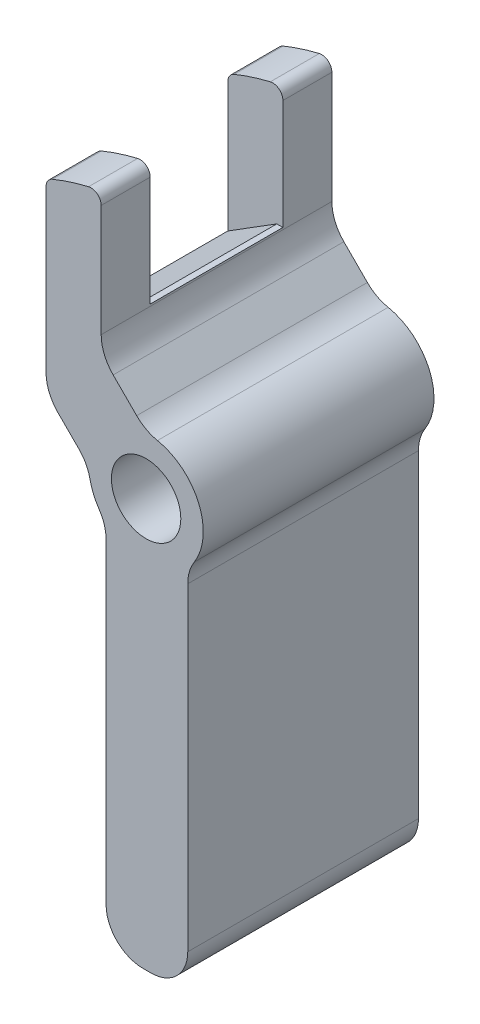
ISO-10303-21;
HEADER;
FILE_DESCRIPTION(('STEP AP214'),'2;1');
FILE_NAME('part.step','',(''),(''),'','','');
FILE_SCHEMA(('AUTOMOTIVE_DESIGN { 1 0 10303 214 1 1 1 1 }'));
ENDSEC;
DATA;
#1=APPLICATION_CONTEXT('core data for automotive mechanical design processes');
#2=APPLICATION_PROTOCOL_DEFINITION('international standard','automotive_design',2000,#1);
#3=PRODUCT_CONTEXT('',#1,'mechanical');
#4=PRODUCT('Part','Part','',(#3));
#5=PRODUCT_RELATED_PRODUCT_CATEGORY('part','',(#4));
#6=PRODUCT_DEFINITION_FORMATION('','',#4);
#7=PRODUCT_DEFINITION_CONTEXT('part definition',#1,'design');
#8=PRODUCT_DEFINITION('design','',#6,#7);
#9=PRODUCT_DEFINITION_SHAPE('','',#8);
#10=(LENGTH_UNIT() NAMED_UNIT(*) SI_UNIT(.MILLI.,.METRE.));
#11=(NAMED_UNIT(*) PLANE_ANGLE_UNIT() SI_UNIT($,.RADIAN.));
#12=(NAMED_UNIT(*) SI_UNIT($,.STERADIAN.) SOLID_ANGLE_UNIT());
#13=UNCERTAINTY_MEASURE_WITH_UNIT(LENGTH_MEASURE(1.E-05),#10,'distance_accuracy_value','');
#14=(GEOMETRIC_REPRESENTATION_CONTEXT(3) GLOBAL_UNCERTAINTY_ASSIGNED_CONTEXT((#13)) GLOBAL_UNIT_ASSIGNED_CONTEXT((#10,
#11,#12)) REPRESENTATION_CONTEXT('',''));
#15=CARTESIAN_POINT('',(0.,0.,0.));
#16=DIRECTION('',(0.,0.,1.));
#17=DIRECTION('',(1.,0.,0.));
#18=AXIS2_PLACEMENT_3D('',#15,#16,#17);
#19=CARTESIAN_POINT('',(4.6996956240946,11.9079283311665,11.3));
#20=DIRECTION('',(0.,0.,-1.));
#21=DIRECTION('',(-1.,0.,0.));
#22=AXIS2_PLACEMENT_3D('',#19,#20,#21);
#23=CYLINDRICAL_SURFACE('',#22,12.1557739077731);
#24=CARTESIAN_POINT('',(4.6996956240946,11.9079283311665,11.3));
#25=DIRECTION('',(0.,0.,1.));
#26=DIRECTION('',(1.,0.,0.));
#27=AXIS2_PLACEMENT_3D('',#24,#25,#26);
#28=CIRCLE('',#27,12.1557739077731);
#29=CARTESIAN_POINT('',(1.88387319903025,23.7330703331638,11.3));
#30=VERTEX_POINT('',#29);
#31=CARTESIAN_POINT('',(0.11094796843419,23.1643147073339,11.3));
#32=VERTEX_POINT('',#31);
#33=EDGE_CURVE('E255',#30,#32,#28,.T.);
#34=ORIENTED_EDGE('',*,*,#33,.F.);
#35=DIRECTION('',(0.,0.,-1.));
#36=VECTOR('',#35,1.);
#37=CARTESIAN_POINT('',(1.88387319903025,23.7330703331638,11.3));
#38=LINE('',#37,#36);
#39=CARTESIAN_POINT('',(1.88387319903025,23.7330703331638,8.9));
#40=VERTEX_POINT('',#39);
#41=EDGE_CURVE('E403',#30,#40,#38,.T.);
#42=ORIENTED_EDGE('',*,*,#41,.T.);
#43=CARTESIAN_POINT('',(4.6996956240946,11.9079283311665,8.9));
#44=DIRECTION('',(0.,0.,1.));
#45=DIRECTION('',(0.,-1.,0.));
#46=AXIS2_PLACEMENT_3D('',#43,#44,#45);
#47=CIRCLE('',#46,12.1557739077731);
#48=CARTESIAN_POINT('',(0.11094796843419,23.1643147073339,8.9));
#49=VERTEX_POINT('',#48);
#50=EDGE_CURVE('E447',#49,#40,#47,.F.);
#51=ORIENTED_EDGE('',*,*,#50,.F.);
#52=DIRECTION('',(0.,0.,-1.));
#53=VECTOR('',#52,1.);
#54=CARTESIAN_POINT('',(0.110947968434189,23.1643147073339,11.3));
#55=LINE('',#54,#53);
#56=EDGE_CURVE('E401',#49,#32,#55,.F.);
#57=ORIENTED_EDGE('',*,*,#56,.T.);
#58=EDGE_LOOP('',(#34,#42,#51,#57));
#59=FACE_BOUND('',#58,.T.);
#60=ADVANCED_FACE('F38',(#59),#23,.T.);
#61=CARTESIAN_POINT('',(4.6996956240946,11.9079283311665,11.3));
#62=DIRECTION('',(0.,0.,1.));
#63=DIRECTION('',(1.,0.,0.));
#64=AXIS2_PLACEMENT_3D('',#61,#62,#63);
#65=PLANE('',#64);
#66=DIRECTION('',(0.,1.,0.));
#67=VECTOR('',#66,1.);
#68=CARTESIAN_POINT('',(2.4996956240946,23.8629623878682,11.3));
#69=LINE('',#68,#67);
#70=CARTESIAN_POINT('',(2.4996956240946,17.7647825806589,11.3));
#71=VERTEX_POINT('',#70);
#72=CARTESIAN_POINT('',(2.4996956240946,23.2466701215559,11.3));
#73=VERTEX_POINT('',#72);
#74=EDGE_CURVE('E290',#71,#73,#69,.T.);
#75=ORIENTED_EDGE('',*,*,#74,.T.);
#76=CARTESIAN_POINT('',(1.9996956240946,23.2466701215559,11.3));
#77=DIRECTION('',(0.,0.,1.));
#78=DIRECTION('',(1.,0.,0.));
#79=AXIS2_PLACEMENT_3D('',#76,#77,#78);
#80=CIRCLE('',#79,0.5);
#81=EDGE_CURVE('E410',#73,#30,#80,.T.);
#82=ORIENTED_EDGE('',*,*,#81,.T.);
#83=ORIENTED_EDGE('',*,*,#33,.T.);
#84=CARTESIAN_POINT('',(0.299695624094605,22.7013089595481,11.3));
#85=DIRECTION('',(0.,0.,1.));
#86=DIRECTION('',(1.,0.,0.));
#87=AXIS2_PLACEMENT_3D('',#84,#85,#86);
#88=CIRCLE('',#87,0.5);
#89=CARTESIAN_POINT('',(-0.200304375905397,22.7013089595481,11.3));
#90=VERTEX_POINT('',#89);
#91=EDGE_CURVE('E53',#32,#90,#88,.T.);
#92=ORIENTED_EDGE('',*,*,#91,.T.);
#93=DIRECTION('',(0.,-1.,0.));
#94=VECTOR('',#93,1.);
#95=CARTESIAN_POINT('',(-0.200304375905404,14.8079283311666,11.3));
#96=LINE('',#95,#94);
#97=CARTESIAN_POINT('',(-0.200304375905399,14.8079283311666,11.3));
#98=VERTEX_POINT('',#97);
#99=EDGE_CURVE('E257',#90,#98,#96,.T.);
#100=ORIENTED_EDGE('',*,*,#99,.T.);
#101=CARTESIAN_POINT('',(1.7996956240946,14.8079283311665,11.3));
#102=DIRECTION('',(0.,0.,1.));
#103=DIRECTION('',(-1.,0.,0.));
#104=AXIS2_PLACEMENT_3D('',#101,#102,#103);
#105=CIRCLE('',#104,2.);
#106=CARTESIAN_POINT('',(0.385482061721495,13.3937147687935,11.3));
#107=VERTEX_POINT('',#106);
#108=EDGE_CURVE('E260',#98,#107,#105,.T.);
#109=ORIENTED_EDGE('',*,*,#108,.T.);
#110=DIRECTION('',(0.707106781186543,-0.707106781186552,0.));
#111=VECTOR('',#110,1.);
#112=CARTESIAN_POINT('',(1.40931575779213,12.3698810727228,11.3));
#113=LINE('',#112,#111);
#114=CARTESIAN_POINT('',(1.40931575779213,12.3698810727228,11.3));
#115=VERTEX_POINT('',#114);
#116=EDGE_CURVE('E262',#107,#115,#113,.T.);
#117=ORIENTED_EDGE('',*,*,#116,.T.);
#118=CARTESIAN_POINT('',(-0.0048978045809622,10.9556675103497,11.3));
#119=DIRECTION('',(0.,0.,-1.));
#120=DIRECTION('',(-1.,0.,0.));
#121=AXIS2_PLACEMENT_3D('',#118,#119,#120);
#122=CIRCLE('',#121,2.);
#123=CARTESIAN_POINT('',(1.95534945736718,11.3524428523567,11.3));
#124=VERTEX_POINT('',#123);
#125=EDGE_CURVE('E264',#115,#124,#122,.T.);
#126=ORIENTED_EDGE('',*,*,#125,.T.);
#127=CARTESIAN_POINT('',(4.6996956240946,11.9079283311665,11.3));
#128=DIRECTION('',(0.,0.,1.));
#129=DIRECTION('',(1.,0.,0.));
#130=AXIS2_PLACEMENT_3D('',#127,#128,#129);
#131=CIRCLE('',#130,2.8);
#132=CARTESIAN_POINT('',(2.3899337441291,10.3252091337539,11.3));
#133=VERTEX_POINT('',#132);
#134=EDGE_CURVE('E266',#124,#133,#131,.T.);
#135=ORIENTED_EDGE('',*,*,#134,.T.);
#136=CARTESIAN_POINT('',(0.740103829868062,9.19469542131638,11.3));
#137=DIRECTION('',(0.,0.,-1.));
#138=DIRECTION('',(-1.,0.,0.));
#139=AXIS2_PLACEMENT_3D('',#136,#137,#138);
#140=CIRCLE('',#139,1.99999999999999);
#141=CARTESIAN_POINT('',(2.74010382986804,9.19469542131641,11.3));
#142=VERTEX_POINT('',#141);
#143=EDGE_CURVE('E268',#133,#142,#140,.T.);
#144=ORIENTED_EDGE('',*,*,#143,.T.);
#145=DIRECTION('',(0.,-1.,0.));
#146=VECTOR('',#145,1.);
#147=CARTESIAN_POINT('',(2.74010382986804,9.19469542131641,11.3));
#148=LINE('',#147,#146);
#149=CARTESIAN_POINT('',(2.740103829868,-6.29207166883347,11.3));
#150=VERTEX_POINT('',#149);
#151=EDGE_CURVE('E270',#142,#150,#148,.T.);
#152=ORIENTED_EDGE('',*,*,#151,.T.);
#153=CARTESIAN_POINT('',(4.540103829868,-6.29207166883347,11.3));
#154=DIRECTION('',(0.,0.,1.));
#155=DIRECTION('',(-1.,0.,0.));
#156=AXIS2_PLACEMENT_3D('',#153,#154,#155);
#157=CIRCLE('',#156,1.8);
#158=CARTESIAN_POINT('',(4.540103829868,-8.09207166883347,11.3));
#159=VERTEX_POINT('',#158);
#160=EDGE_CURVE('E272',#150,#159,#157,.T.);
#161=ORIENTED_EDGE('',*,*,#160,.T.);
#162=DIRECTION('',(1.,0.,0.));
#163=VECTOR('',#162,1.);
#164=CARTESIAN_POINT('',(4.940103829868,-8.09207166883347,11.3));
#165=LINE('',#164,#163);
#166=CARTESIAN_POINT('',(4.940103829868,-8.09207166883347,11.3));
#167=VERTEX_POINT('',#166);
#168=EDGE_CURVE('E274',#159,#167,#165,.T.);
#169=ORIENTED_EDGE('',*,*,#168,.T.);
#170=CARTESIAN_POINT('',(4.940103829868,-6.29207166883347,11.3));
#171=DIRECTION('',(0.,0.,1.));
#172=DIRECTION('',(-1.,0.,0.));
#173=AXIS2_PLACEMENT_3D('',#170,#171,#172);
#174=CIRCLE('',#173,1.8);
#175=CARTESIAN_POINT('',(6.740103829868,-6.29207166883347,11.3));
#176=VERTEX_POINT('',#175);
#177=EDGE_CURVE('E276',#167,#176,#174,.T.);
#178=ORIENTED_EDGE('',*,*,#177,.T.);
#179=DIRECTION('',(0.,1.,0.));
#180=VECTOR('',#179,1.);
#181=CARTESIAN_POINT('',(6.740103829868,-6.29207166883347,11.3));
#182=LINE('',#181,#180);
#183=CARTESIAN_POINT('',(6.74010382986805,9.3165770368186,11.3));
#184=VERTEX_POINT('',#183);
#185=EDGE_CURVE('E278',#176,#184,#182,.T.);
#186=ORIENTED_EDGE('',*,*,#185,.T.);
#187=CARTESIAN_POINT('',(8.74010382986806,9.31657703681862,11.3));
#188=DIRECTION('',(0.,0.,-1.));
#189=DIRECTION('',(-1.,0.,0.));
#190=AXIS2_PLACEMENT_3D('',#187,#188,#189);
#191=CIRCLE('',#190,2.00000000000002);
#192=CARTESIAN_POINT('',(7.05660041079577,10.3963067427969,11.3));
#193=VERTEX_POINT('',#192);
#194=EDGE_CURVE('E280',#184,#193,#191,.T.);
#195=ORIENTED_EDGE('',*,*,#194,.T.);
#196=CARTESIAN_POINT('',(4.6996956240946,11.9079283311665,11.3));
#197=DIRECTION('',(0.,0.,1.));
#198=DIRECTION('',(1.,0.,0.));
#199=AXIS2_PLACEMENT_3D('',#196,#197,#198);
#200=CIRCLE('',#199,2.8);
#201=CARTESIAN_POINT('',(5.25518110290442,14.6522744978939,11.3));
#202=VERTEX_POINT('',#201);
#203=EDGE_CURVE('E282',#193,#202,#200,.T.);
#204=ORIENTED_EDGE('',*,*,#203,.T.);
#205=CARTESIAN_POINT('',(5.65195644491145,16.6125217598421,11.3));
#206=DIRECTION('',(0.,0.,-1.));
#207=DIRECTION('',(1.,0.,0.));
#208=AXIS2_PLACEMENT_3D('',#205,#206,#207);
#209=CIRCLE('',#208,2.);
#210=CARTESIAN_POINT('',(4.23774288253834,15.198308197469,11.3));
#211=VERTEX_POINT('',#210);
#212=EDGE_CURVE('E284',#202,#211,#209,.T.);
#213=ORIENTED_EDGE('',*,*,#212,.T.);
#214=DIRECTION('',(-0.707106781186544,0.707106781186551,0.));
#215=VECTOR('',#214,1.);
#216=CARTESIAN_POINT('',(4.23774288253834,15.198308197469,11.3));
#217=LINE('',#216,#215);
#218=CARTESIAN_POINT('',(3.0854820617215,16.3505690182858,11.3));
#219=VERTEX_POINT('',#218);
#220=EDGE_CURVE('E286',#211,#219,#217,.T.);
#221=ORIENTED_EDGE('',*,*,#220,.T.);
#222=CARTESIAN_POINT('',(4.49969562409461,17.7647825806589,11.3));
#223=DIRECTION('',(0.,0.,-1.));
#224=DIRECTION('',(1.,0.,0.));
#225=AXIS2_PLACEMENT_3D('',#222,#223,#224);
#226=CIRCLE('',#225,2.);
#227=EDGE_CURVE('E288',#219,#71,#226,.T.);
#228=ORIENTED_EDGE('',*,*,#227,.T.);
#229=EDGE_LOOP('',(#75,#82,#83,#92,#100,#109,#117,#126,#135,#144,#152,#161,#169,#178,#186,#195,
#204,#213,#221,#228));
#230=FACE_BOUND('',#229,.T.);
#231=CARTESIAN_POINT('',(4.6996956240946,11.9079283311665,11.3));
#232=DIRECTION('',(0.,0.,1.));
#233=DIRECTION('',(1.,0.,0.));
#234=AXIS2_PLACEMENT_3D('',#231,#232,#233);
#235=CIRCLE('',#234,1.7);
#236=CARTESIAN_POINT('',(6.3996956240946,11.9079283311665,11.3));
#237=VERTEX_POINT('',#236);
#238=EDGE_CURVE('E249',#237,#237,#235,.T.);
#239=ORIENTED_EDGE('',*,*,#238,.F.);
#240=EDGE_LOOP('',(#239));
#241=FACE_BOUND('',#240,.T.);
#242=ADVANCED_FACE('F437',(#230,#241),#65,.T.);
#243=CARTESIAN_POINT('',(4.6996956240946,11.9079283311665,0.));
#244=DIRECTION('',(0.,0.,1.));
#245=DIRECTION('',(1.,0.,0.));
#246=AXIS2_PLACEMENT_3D('',#243,#244,#245);
#247=PLANE('',#246);
#248=CARTESIAN_POINT('',(4.6996956240946,11.9079283311665,0.));
#249=DIRECTION('',(0.,0.,1.));
#250=DIRECTION('',(1.,0.,0.));
#251=AXIS2_PLACEMENT_3D('',#248,#249,#250);
#252=CIRCLE('',#251,12.1557739077731);
#253=CARTESIAN_POINT('',(1.88387319903025,23.7330703331638,0.));
#254=VERTEX_POINT('',#253);
#255=CARTESIAN_POINT('',(0.11094796843419,23.1643147073339,0.));
#256=VERTEX_POINT('',#255);
#257=EDGE_CURVE('E252',#254,#256,#252,.T.);
#258=ORIENTED_EDGE('',*,*,#257,.F.);
#259=CARTESIAN_POINT('',(1.9996956240946,23.2466701215559,0.));
#260=DIRECTION('',(0.,0.,1.));
#261=DIRECTION('',(1.,0.,0.));
#262=AXIS2_PLACEMENT_3D('',#259,#260,#261);
#263=CIRCLE('',#262,0.5);
#264=CARTESIAN_POINT('',(2.4996956240946,23.2466701215559,0.));
#265=VERTEX_POINT('',#264);
#266=EDGE_CURVE('E392',#254,#265,#263,.F.);
#267=ORIENTED_EDGE('',*,*,#266,.T.);
#268=DIRECTION('',(0.,1.,0.));
#269=VECTOR('',#268,1.);
#270=CARTESIAN_POINT('',(2.4996956240946,23.8629623878682,0.));
#271=LINE('',#270,#269);
#272=CARTESIAN_POINT('',(2.4996956240946,17.7647825806589,0.));
#273=VERTEX_POINT('',#272);
#274=EDGE_CURVE('E258',#273,#265,#271,.T.);
#275=ORIENTED_EDGE('',*,*,#274,.F.);
#276=CARTESIAN_POINT('',(4.49969562409461,17.7647825806589,0.));
#277=DIRECTION('',(0.,0.,-1.));
#278=DIRECTION('',(1.,0.,0.));
#279=AXIS2_PLACEMENT_3D('',#276,#277,#278);
#280=CIRCLE('',#279,2.);
#281=CARTESIAN_POINT('',(3.0854820617215,16.3505690182858,0.));
#282=VERTEX_POINT('',#281);
#283=EDGE_CURVE('E326',#282,#273,#280,.T.);
#284=ORIENTED_EDGE('',*,*,#283,.F.);
#285=DIRECTION('',(-0.707106781186544,0.707106781186551,0.));
#286=VECTOR('',#285,1.);
#287=CARTESIAN_POINT('',(4.23774288253834,15.198308197469,0.));
#288=LINE('',#287,#286);
#289=CARTESIAN_POINT('',(4.23774288253834,15.198308197469,0.));
#290=VERTEX_POINT('',#289);
#291=EDGE_CURVE('E324',#290,#282,#288,.T.);
#292=ORIENTED_EDGE('',*,*,#291,.F.);
#293=CARTESIAN_POINT('',(5.65195644491145,16.6125217598421,0.));
#294=DIRECTION('',(0.,0.,-1.));
#295=DIRECTION('',(1.,0.,0.));
#296=AXIS2_PLACEMENT_3D('',#293,#294,#295);
#297=CIRCLE('',#296,2.);
#298=CARTESIAN_POINT('',(5.25518110290442,14.6522744978939,0.));
#299=VERTEX_POINT('',#298);
#300=EDGE_CURVE('E322',#299,#290,#297,.T.);
#301=ORIENTED_EDGE('',*,*,#300,.F.);
#302=CARTESIAN_POINT('',(4.6996956240946,11.9079283311665,0.));
#303=DIRECTION('',(0.,0.,1.));
#304=DIRECTION('',(1.,0.,0.));
#305=AXIS2_PLACEMENT_3D('',#302,#303,#304);
#306=CIRCLE('',#305,2.8);
#307=CARTESIAN_POINT('',(7.05660041079577,10.3963067427969,0.));
#308=VERTEX_POINT('',#307);
#309=EDGE_CURVE('E320',#308,#299,#306,.T.);
#310=ORIENTED_EDGE('',*,*,#309,.F.);
#311=CARTESIAN_POINT('',(8.74010382986806,9.31657703681862,0.));
#312=DIRECTION('',(0.,0.,-1.));
#313=DIRECTION('',(-1.,0.,0.));
#314=AXIS2_PLACEMENT_3D('',#311,#312,#313);
#315=CIRCLE('',#314,2.00000000000002);
#316=CARTESIAN_POINT('',(6.74010382986805,9.3165770368186,0.));
#317=VERTEX_POINT('',#316);
#318=EDGE_CURVE('E318',#317,#308,#315,.T.);
#319=ORIENTED_EDGE('',*,*,#318,.F.);
#320=DIRECTION('',(0.,1.,0.));
#321=VECTOR('',#320,1.);
#322=CARTESIAN_POINT('',(6.740103829868,-6.29207166883347,0.));
#323=LINE('',#322,#321);
#324=CARTESIAN_POINT('',(6.740103829868,-6.29207166883347,0.));
#325=VERTEX_POINT('',#324);
#326=EDGE_CURVE('E316',#325,#317,#323,.T.);
#327=ORIENTED_EDGE('',*,*,#326,.F.);
#328=CARTESIAN_POINT('',(4.940103829868,-6.29207166883347,0.));
#329=DIRECTION('',(0.,0.,1.));
#330=DIRECTION('',(-1.,0.,0.));
#331=AXIS2_PLACEMENT_3D('',#328,#329,#330);
#332=CIRCLE('',#331,1.8);
#333=CARTESIAN_POINT('',(4.940103829868,-8.09207166883347,0.));
#334=VERTEX_POINT('',#333);
#335=EDGE_CURVE('E314',#334,#325,#332,.T.);
#336=ORIENTED_EDGE('',*,*,#335,.F.);
#337=DIRECTION('',(1.,0.,0.));
#338=VECTOR('',#337,1.);
#339=CARTESIAN_POINT('',(4.940103829868,-8.09207166883347,0.));
#340=LINE('',#339,#338);
#341=CARTESIAN_POINT('',(4.540103829868,-8.09207166883347,0.));
#342=VERTEX_POINT('',#341);
#343=EDGE_CURVE('E312',#342,#334,#340,.T.);
#344=ORIENTED_EDGE('',*,*,#343,.F.);
#345=CARTESIAN_POINT('',(4.540103829868,-6.29207166883347,0.));
#346=DIRECTION('',(0.,0.,1.));
#347=DIRECTION('',(-1.,0.,0.));
#348=AXIS2_PLACEMENT_3D('',#345,#346,#347);
#349=CIRCLE('',#348,1.8);
#350=CARTESIAN_POINT('',(2.740103829868,-6.29207166883347,0.));
#351=VERTEX_POINT('',#350);
#352=EDGE_CURVE('E310',#351,#342,#349,.T.);
#353=ORIENTED_EDGE('',*,*,#352,.F.);
#354=DIRECTION('',(0.,-1.,0.));
#355=VECTOR('',#354,1.);
#356=CARTESIAN_POINT('',(2.74010382986804,9.19469542131641,0.));
#357=LINE('',#356,#355);
#358=CARTESIAN_POINT('',(2.74010382986804,9.19469542131641,0.));
#359=VERTEX_POINT('',#358);
#360=EDGE_CURVE('E308',#359,#351,#357,.T.);
#361=ORIENTED_EDGE('',*,*,#360,.F.);
#362=CARTESIAN_POINT('',(0.740103829868062,9.19469542131638,0.));
#363=DIRECTION('',(0.,0.,-1.));
#364=DIRECTION('',(-1.,0.,0.));
#365=AXIS2_PLACEMENT_3D('',#362,#363,#364);
#366=CIRCLE('',#365,1.99999999999999);
#367=CARTESIAN_POINT('',(2.3899337441291,10.3252091337539,0.));
#368=VERTEX_POINT('',#367);
#369=EDGE_CURVE('E306',#368,#359,#366,.T.);
#370=ORIENTED_EDGE('',*,*,#369,.F.);
#371=CARTESIAN_POINT('',(4.6996956240946,11.9079283311665,0.));
#372=DIRECTION('',(0.,0.,1.));
#373=DIRECTION('',(1.,0.,0.));
#374=AXIS2_PLACEMENT_3D('',#371,#372,#373);
#375=CIRCLE('',#374,2.8);
#376=CARTESIAN_POINT('',(1.95534945736718,11.3524428523567,0.));
#377=VERTEX_POINT('',#376);
#378=EDGE_CURVE('E304',#377,#368,#375,.T.);
#379=ORIENTED_EDGE('',*,*,#378,.F.);
#380=CARTESIAN_POINT('',(-0.0048978045809622,10.9556675103497,0.));
#381=DIRECTION('',(0.,0.,-1.));
#382=DIRECTION('',(-1.,0.,0.));
#383=AXIS2_PLACEMENT_3D('',#380,#381,#382);
#384=CIRCLE('',#383,2.);
#385=CARTESIAN_POINT('',(1.40931575779213,12.3698810727228,0.));
#386=VERTEX_POINT('',#385);
#387=EDGE_CURVE('E302',#386,#377,#384,.T.);
#388=ORIENTED_EDGE('',*,*,#387,.F.);
#389=DIRECTION('',(0.707106781186543,-0.707106781186552,0.));
#390=VECTOR('',#389,1.);
#391=CARTESIAN_POINT('',(1.40931575779213,12.3698810727228,0.));
#392=LINE('',#391,#390);
#393=CARTESIAN_POINT('',(0.385482061721495,13.3937147687935,0.));
#394=VERTEX_POINT('',#393);
#395=EDGE_CURVE('E300',#394,#386,#392,.T.);
#396=ORIENTED_EDGE('',*,*,#395,.F.);
#397=CARTESIAN_POINT('',(1.7996956240946,14.8079283311665,0.));
#398=DIRECTION('',(0.,0.,1.));
#399=DIRECTION('',(-1.,0.,0.));
#400=AXIS2_PLACEMENT_3D('',#397,#398,#399);
#401=CIRCLE('',#400,2.);
#402=CARTESIAN_POINT('',(-0.200304375905399,14.8079283311666,0.));
#403=VERTEX_POINT('',#402);
#404=EDGE_CURVE('E298',#403,#394,#401,.T.);
#405=ORIENTED_EDGE('',*,*,#404,.F.);
#406=DIRECTION('',(0.,-1.,0.));
#407=VECTOR('',#406,1.);
#408=CARTESIAN_POINT('',(-0.200304375905404,14.8079283311666,0.));
#409=LINE('',#408,#407);
#410=CARTESIAN_POINT('',(-0.200304375905397,22.7013089595481,0.));
#411=VERTEX_POINT('',#410);
#412=EDGE_CURVE('E296',#411,#403,#409,.T.);
#413=ORIENTED_EDGE('',*,*,#412,.F.);
#414=CARTESIAN_POINT('',(0.299695624094605,22.7013089595481,0.));
#415=DIRECTION('',(0.,0.,1.));
#416=DIRECTION('',(1.,0.,0.));
#417=AXIS2_PLACEMENT_3D('',#414,#415,#416);
#418=CIRCLE('',#417,0.5);
#419=EDGE_CURVE('E390',#411,#256,#418,.F.);
#420=ORIENTED_EDGE('',*,*,#419,.T.);
#421=EDGE_LOOP('',(#258,#267,#275,#284,#292,#301,#310,#319,#327,#336,#344,#353,#361,#370,#379,
#388,#396,#405,#413,#420));
#422=FACE_BOUND('',#421,.T.);
#423=CARTESIAN_POINT('',(4.6996956240946,11.9079283311665,0.));
#424=DIRECTION('',(0.,0.,1.));
#425=DIRECTION('',(1.,0.,0.));
#426=AXIS2_PLACEMENT_3D('',#423,#424,#425);
#427=CIRCLE('',#426,1.7);
#428=CARTESIAN_POINT('',(6.3996956240946,11.9079283311665,0.));
#429=VERTEX_POINT('',#428);
#430=EDGE_CURVE('E229',#429,#429,#427,.T.);
#431=ORIENTED_EDGE('',*,*,#430,.T.);
#432=EDGE_LOOP('',(#431));
#433=FACE_BOUND('',#432,.T.);
#434=ADVANCED_FACE('F424',(#422,#433),#247,.F.);
#435=CARTESIAN_POINT('',(4.6996956240946,11.9079283311665,2.4));
#436=DIRECTION('',(0.,0.,-1.));
#437=DIRECTION('',(0.,1.,0.));
#438=AXIS2_PLACEMENT_3D('',#435,#436,#437);
#439=CIRCLE('',#438,12.1557739077731);
#440=CARTESIAN_POINT('',(1.88387319903025,23.7330703331638,2.4));
#441=VERTEX_POINT('',#440);
#442=CARTESIAN_POINT('',(0.11094796843419,23.1643147073339,2.4));
#443=VERTEX_POINT('',#442);
#444=EDGE_CURVE('E455',#441,#443,#439,.F.);
#445=ORIENTED_EDGE('',*,*,#444,.F.);
#446=DIRECTION('',(0.,0.,-1.));
#447=VECTOR('',#446,1.);
#448=CARTESIAN_POINT('',(1.88387319903025,23.7330703331638,11.3));
#449=LINE('',#448,#447);
#450=EDGE_CURVE('E387',#441,#254,#449,.T.);
#451=ORIENTED_EDGE('',*,*,#450,.T.);
#452=ORIENTED_EDGE('',*,*,#257,.T.);
#453=DIRECTION('',(0.,0.,-1.));
#454=VECTOR('',#453,1.);
#455=CARTESIAN_POINT('',(0.110947968434189,23.1643147073339,11.3));
#456=LINE('',#455,#454);
#457=EDGE_CURVE('E385',#256,#443,#456,.F.);
#458=ORIENTED_EDGE('',*,*,#457,.T.);
#459=EDGE_LOOP('',(#445,#451,#452,#458));
#460=FACE_BOUND('',#459,.T.);
#461=ADVANCED_FACE('F473',(#460),#23,.T.);
#462=CARTESIAN_POINT('',(-0.200304375905404,14.8079283311666,11.3));
#463=DIRECTION('',(1.,0.,0.));
#464=DIRECTION('',(0.,1.,0.));
#465=AXIS2_PLACEMENT_3D('',#462,#463,#464);
#466=PLANE('',#465);
#467=ORIENTED_EDGE('',*,*,#99,.F.);
#468=DIRECTION('',(0.,0.,-1.));
#469=VECTOR('',#468,1.);
#470=CARTESIAN_POINT('',(-0.200304375905397,22.7013089595481,11.3));
#471=LINE('',#470,#469);
#472=CARTESIAN_POINT('',(-0.200304375905397,22.7013089595481,8.9));
#473=VERTEX_POINT('',#472);
#474=EDGE_CURVE('E12',#90,#473,#471,.T.);
#475=ORIENTED_EDGE('',*,*,#474,.T.);
#476=DIRECTION('',(0.,1.,0.));
#477=VECTOR('',#476,1.);
#478=CARTESIAN_POINT('',(-0.200304375905396,23.8629623878682,8.9));
#479=LINE('',#478,#477);
#480=CARTESIAN_POINT('',(-0.200304375905402,16.3629623878682,8.9));
#481=VERTEX_POINT('',#480);
#482=EDGE_CURVE('E457',#481,#473,#479,.T.);
#483=ORIENTED_EDGE('',*,*,#482,.F.);
#484=DIRECTION('',(0.,0.,-1.));
#485=VECTOR('',#484,1.);
#486=CARTESIAN_POINT('',(-0.200304375905402,16.3629623878682,11.3));
#487=LINE('',#486,#485);
#488=CARTESIAN_POINT('',(-0.200304375905402,16.3629623878682,2.4));
#489=VERTEX_POINT('',#488);
#490=EDGE_CURVE('E378',#481,#489,#487,.T.);
#491=ORIENTED_EDGE('',*,*,#490,.T.);
#492=DIRECTION('',(0.,-1.,0.));
#493=VECTOR('',#492,1.);
#494=CARTESIAN_POINT('',(-0.200304375905396,23.8629623878682,2.4));
#495=LINE('',#494,#493);
#496=CARTESIAN_POINT('',(-0.200304375905397,22.7013089595481,2.4));
#497=VERTEX_POINT('',#496);
#498=EDGE_CURVE('E418',#497,#489,#495,.T.);
#499=ORIENTED_EDGE('',*,*,#498,.F.);
#500=DIRECTION('',(0.,0.,-1.));
#501=VECTOR('',#500,1.);
#502=CARTESIAN_POINT('',(-0.200304375905397,22.7013089595481,11.3));
#503=LINE('',#502,#501);
#504=EDGE_CURVE('E46',#497,#411,#503,.T.);
#505=ORIENTED_EDGE('',*,*,#504,.T.);
#506=ORIENTED_EDGE('',*,*,#412,.T.);
#507=DIRECTION('',(0.,0.,-1.));
#508=VECTOR('',#507,1.);
#509=CARTESIAN_POINT('',(-0.200304375905399,14.8079283311666,11.3));
#510=LINE('',#509,#508);
#511=EDGE_CURVE('E373',#98,#403,#510,.T.);
#512=ORIENTED_EDGE('',*,*,#511,.F.);
#513=EDGE_LOOP('',(#467,#475,#483,#491,#499,#505,#506,#512));
#514=FACE_BOUND('',#513,.T.);
#515=ADVANCED_FACE('F416',(#514),#466,.F.);
#516=CARTESIAN_POINT('',(1.7996956240946,14.8079283311665,11.3));
#517=DIRECTION('',(0.,0.,-1.));
#518=DIRECTION('',(-1.,0.,0.));
#519=AXIS2_PLACEMENT_3D('',#516,#517,#518);
#520=CYLINDRICAL_SURFACE('',#519,2.);
#521=ORIENTED_EDGE('',*,*,#404,.T.);
#522=DIRECTION('',(0.,0.,-1.));
#523=VECTOR('',#522,1.);
#524=CARTESIAN_POINT('',(0.385482061721495,13.3937147687935,11.3));
#525=LINE('',#524,#523);
#526=EDGE_CURVE('E370',#107,#394,#525,.T.);
#527=ORIENTED_EDGE('',*,*,#526,.F.);
#528=ORIENTED_EDGE('',*,*,#108,.F.);
#529=ORIENTED_EDGE('',*,*,#511,.T.);
#530=EDGE_LOOP('',(#521,#527,#528,#529));
#531=FACE_BOUND('',#530,.T.);
#532=ADVANCED_FACE('F430',(#531),#520,.T.);
#533=CARTESIAN_POINT('',(1.40931575779213,12.3698810727228,11.3));
#534=DIRECTION('',(0.707106781186552,0.707106781186543,0.));
#535=DIRECTION('',(-0.707106781186543,0.707106781186552,0.));
#536=AXIS2_PLACEMENT_3D('',#533,#534,#535);
#537=PLANE('',#536);
#538=ORIENTED_EDGE('',*,*,#395,.T.);
#539=DIRECTION('',(0.,0.,-1.));
#540=VECTOR('',#539,1.);
#541=CARTESIAN_POINT('',(1.40931575779213,12.3698810727228,11.3));
#542=LINE('',#541,#540);
#543=EDGE_CURVE('E367',#115,#386,#542,.T.);
#544=ORIENTED_EDGE('',*,*,#543,.F.);
#545=ORIENTED_EDGE('',*,*,#116,.F.);
#546=ORIENTED_EDGE('',*,*,#526,.T.);
#547=EDGE_LOOP('',(#538,#544,#545,#546));
#548=FACE_BOUND('',#547,.T.);
#549=ADVANCED_FACE('F434',(#548),#537,.F.);
#550=CARTESIAN_POINT('',(-0.0048978045809622,10.9556675103497,11.3));
#551=DIRECTION('',(0.,0.,-1.));
#552=DIRECTION('',(-1.,0.,0.));
#553=AXIS2_PLACEMENT_3D('',#550,#551,#552);
#554=CYLINDRICAL_SURFACE('',#553,2.);
#555=ORIENTED_EDGE('',*,*,#387,.T.);
#556=DIRECTION('',(0.,0.,-1.));
#557=VECTOR('',#556,1.);
#558=CARTESIAN_POINT('',(1.95534945736718,11.3524428523567,11.3));
#559=LINE('',#558,#557);
#560=EDGE_CURVE('E364',#124,#377,#559,.T.);
#561=ORIENTED_EDGE('',*,*,#560,.F.);
#562=ORIENTED_EDGE('',*,*,#125,.F.);
#563=ORIENTED_EDGE('',*,*,#543,.T.);
#564=EDGE_LOOP('',(#555,#561,#562,#563));
#565=FACE_BOUND('',#564,.T.);
#566=ADVANCED_FACE('F547',(#565),#554,.F.);
#567=CARTESIAN_POINT('',(4.6996956240946,11.9079283311665,11.3));
#568=DIRECTION('',(0.,0.,-1.));
#569=DIRECTION('',(-1.,0.,0.));
#570=AXIS2_PLACEMENT_3D('',#567,#568,#569);
#571=CYLINDRICAL_SURFACE('',#570,2.8);
#572=ORIENTED_EDGE('',*,*,#378,.T.);
#573=DIRECTION('',(0.,0.,-1.));
#574=VECTOR('',#573,1.);
#575=CARTESIAN_POINT('',(2.3899337441291,10.3252091337539,11.3));
#576=LINE('',#575,#574);
#577=EDGE_CURVE('E361',#133,#368,#576,.T.);
#578=ORIENTED_EDGE('',*,*,#577,.F.);
#579=ORIENTED_EDGE('',*,*,#134,.F.);
#580=ORIENTED_EDGE('',*,*,#560,.T.);
#581=EDGE_LOOP('',(#572,#578,#579,#580));
#582=FACE_BOUND('',#581,.T.);
#583=ADVANCED_FACE('F543',(#582),#571,.T.);
#584=CARTESIAN_POINT('',(0.740103829868062,9.19469542131638,11.3));
#585=DIRECTION('',(0.,0.,-1.));
#586=DIRECTION('',(-1.,0.,0.));
#587=AXIS2_PLACEMENT_3D('',#584,#585,#586);
#588=CYLINDRICAL_SURFACE('',#587,1.99999999999999);
#589=ORIENTED_EDGE('',*,*,#369,.T.);
#590=DIRECTION('',(0.,0.,-1.));
#591=VECTOR('',#590,1.);
#592=CARTESIAN_POINT('',(2.74010382986804,9.19469542131641,11.3));
#593=LINE('',#592,#591);
#594=EDGE_CURVE('E358',#142,#359,#593,.T.);
#595=ORIENTED_EDGE('',*,*,#594,.F.);
#596=ORIENTED_EDGE('',*,*,#143,.F.);
#597=ORIENTED_EDGE('',*,*,#577,.T.);
#598=EDGE_LOOP('',(#589,#595,#596,#597));
#599=FACE_BOUND('',#598,.T.);
#600=ADVANCED_FACE('F539',(#599),#588,.F.);
#601=CARTESIAN_POINT('',(2.74010382986804,9.19469542131641,11.3));
#602=DIRECTION('',(1.,0.,0.));
#603=DIRECTION('',(0.,1.,0.));
#604=AXIS2_PLACEMENT_3D('',#601,#602,#603);
#605=PLANE('',#604);
#606=ORIENTED_EDGE('',*,*,#360,.T.);
#607=DIRECTION('',(0.,0.,-1.));
#608=VECTOR('',#607,1.);
#609=CARTESIAN_POINT('',(2.740103829868,-6.29207166883347,11.3));
#610=LINE('',#609,#608);
#611=EDGE_CURVE('E355',#150,#351,#610,.T.);
#612=ORIENTED_EDGE('',*,*,#611,.F.);
#613=ORIENTED_EDGE('',*,*,#151,.F.);
#614=ORIENTED_EDGE('',*,*,#594,.T.);
#615=EDGE_LOOP('',(#606,#612,#613,#614));
#616=FACE_BOUND('',#615,.T.);
#617=ADVANCED_FACE('F535',(#616),#605,.F.);
#618=CARTESIAN_POINT('',(4.540103829868,-6.29207166883347,11.3));
#619=DIRECTION('',(0.,0.,-1.));
#620=DIRECTION('',(-1.,0.,0.));
#621=AXIS2_PLACEMENT_3D('',#618,#619,#620);
#622=CYLINDRICAL_SURFACE('',#621,1.8);
#623=ORIENTED_EDGE('',*,*,#352,.T.);
#624=DIRECTION('',(0.,0.,-1.));
#625=VECTOR('',#624,1.);
#626=CARTESIAN_POINT('',(4.540103829868,-8.09207166883347,11.3));
#627=LINE('',#626,#625);
#628=EDGE_CURVE('E352',#159,#342,#627,.T.);
#629=ORIENTED_EDGE('',*,*,#628,.F.);
#630=ORIENTED_EDGE('',*,*,#160,.F.);
#631=ORIENTED_EDGE('',*,*,#611,.T.);
#632=EDGE_LOOP('',(#623,#629,#630,#631));
#633=FACE_BOUND('',#632,.T.);
#634=ADVANCED_FACE('F531',(#633),#622,.T.);
#635=CARTESIAN_POINT('',(4.940103829868,-8.09207166883347,11.3));
#636=DIRECTION('',(0.,1.,0.));
#637=DIRECTION('',(-1.,0.,0.));
#638=AXIS2_PLACEMENT_3D('',#635,#636,#637);
#639=PLANE('',#638);
#640=ORIENTED_EDGE('',*,*,#343,.T.);
#641=DIRECTION('',(0.,0.,-1.));
#642=VECTOR('',#641,1.);
#643=CARTESIAN_POINT('',(4.940103829868,-8.09207166883347,11.3));
#644=LINE('',#643,#642);
#645=EDGE_CURVE('E349',#167,#334,#644,.T.);
#646=ORIENTED_EDGE('',*,*,#645,.F.);
#647=ORIENTED_EDGE('',*,*,#168,.F.);
#648=ORIENTED_EDGE('',*,*,#628,.T.);
#649=EDGE_LOOP('',(#640,#646,#647,#648));
#650=FACE_BOUND('',#649,.T.);
#651=ADVANCED_FACE('F527',(#650),#639,.F.);
#652=CARTESIAN_POINT('',(4.940103829868,-6.29207166883347,11.3));
#653=DIRECTION('',(0.,0.,-1.));
#654=DIRECTION('',(-1.,0.,0.));
#655=AXIS2_PLACEMENT_3D('',#652,#653,#654);
#656=CYLINDRICAL_SURFACE('',#655,1.8);
#657=ORIENTED_EDGE('',*,*,#335,.T.);
#658=DIRECTION('',(0.,0.,-1.));
#659=VECTOR('',#658,1.);
#660=CARTESIAN_POINT('',(6.740103829868,-6.29207166883347,11.3));
#661=LINE('',#660,#659);
#662=EDGE_CURVE('E346',#176,#325,#661,.T.);
#663=ORIENTED_EDGE('',*,*,#662,.F.);
#664=ORIENTED_EDGE('',*,*,#177,.F.);
#665=ORIENTED_EDGE('',*,*,#645,.T.);
#666=EDGE_LOOP('',(#657,#663,#664,#665));
#667=FACE_BOUND('',#666,.T.);
#668=ADVANCED_FACE('F523',(#667),#656,.T.);
#669=CARTESIAN_POINT('',(6.740103829868,-6.29207166883347,11.3));
#670=DIRECTION('',(-1.,0.,0.));
#671=DIRECTION('',(0.,-1.,0.));
#672=AXIS2_PLACEMENT_3D('',#669,#670,#671);
#673=PLANE('',#672);
#674=ORIENTED_EDGE('',*,*,#326,.T.);
#675=DIRECTION('',(0.,0.,-1.));
#676=VECTOR('',#675,1.);
#677=CARTESIAN_POINT('',(6.74010382986805,9.3165770368186,11.3));
#678=LINE('',#677,#676);
#679=EDGE_CURVE('E343',#184,#317,#678,.T.);
#680=ORIENTED_EDGE('',*,*,#679,.F.);
#681=ORIENTED_EDGE('',*,*,#185,.F.);
#682=ORIENTED_EDGE('',*,*,#662,.T.);
#683=EDGE_LOOP('',(#674,#680,#681,#682));
#684=FACE_BOUND('',#683,.T.);
#685=ADVANCED_FACE('F519',(#684),#673,.F.);
#686=CARTESIAN_POINT('',(8.74010382986806,9.31657703681862,11.3));
#687=DIRECTION('',(0.,0.,-1.));
#688=DIRECTION('',(-1.,0.,0.));
#689=AXIS2_PLACEMENT_3D('',#686,#687,#688);
#690=CYLINDRICAL_SURFACE('',#689,2.00000000000002);
#691=ORIENTED_EDGE('',*,*,#318,.T.);
#692=DIRECTION('',(0.,0.,-1.));
#693=VECTOR('',#692,1.);
#694=CARTESIAN_POINT('',(7.05660041079577,10.3963067427969,11.3));
#695=LINE('',#694,#693);
#696=EDGE_CURVE('E340',#193,#308,#695,.T.);
#697=ORIENTED_EDGE('',*,*,#696,.F.);
#698=ORIENTED_EDGE('',*,*,#194,.F.);
#699=ORIENTED_EDGE('',*,*,#679,.T.);
#700=EDGE_LOOP('',(#691,#697,#698,#699));
#701=FACE_BOUND('',#700,.T.);
#702=ADVANCED_FACE('F515',(#701),#690,.F.);
#703=CARTESIAN_POINT('',(4.6996956240946,11.9079283311665,11.3));
#704=DIRECTION('',(0.,0.,-1.));
#705=DIRECTION('',(-1.,0.,0.));
#706=AXIS2_PLACEMENT_3D('',#703,#704,#705);
#707=CYLINDRICAL_SURFACE('',#706,2.8);
#708=ORIENTED_EDGE('',*,*,#309,.T.);
#709=DIRECTION('',(0.,0.,-1.));
#710=VECTOR('',#709,1.);
#711=CARTESIAN_POINT('',(5.25518110290442,14.6522744978939,11.3));
#712=LINE('',#711,#710);
#713=EDGE_CURVE('E337',#202,#299,#712,.T.);
#714=ORIENTED_EDGE('',*,*,#713,.F.);
#715=ORIENTED_EDGE('',*,*,#203,.F.);
#716=ORIENTED_EDGE('',*,*,#696,.T.);
#717=EDGE_LOOP('',(#708,#714,#715,#716));
#718=FACE_BOUND('',#717,.T.);
#719=ADVANCED_FACE('F511',(#718),#707,.T.);
#720=CARTESIAN_POINT('',(5.65195644491145,16.6125217598421,11.3));
#721=DIRECTION('',(0.,0.,-1.));
#722=DIRECTION('',(-1.,0.,0.));
#723=AXIS2_PLACEMENT_3D('',#720,#721,#722);
#724=CYLINDRICAL_SURFACE('',#723,2.);
#725=ORIENTED_EDGE('',*,*,#300,.T.);
#726=DIRECTION('',(0.,0.,-1.));
#727=VECTOR('',#726,1.);
#728=CARTESIAN_POINT('',(4.23774288253834,15.198308197469,11.3));
#729=LINE('',#728,#727);
#730=EDGE_CURVE('E334',#211,#290,#729,.T.);
#731=ORIENTED_EDGE('',*,*,#730,.F.);
#732=ORIENTED_EDGE('',*,*,#212,.F.);
#733=ORIENTED_EDGE('',*,*,#713,.T.);
#734=EDGE_LOOP('',(#725,#731,#732,#733));
#735=FACE_BOUND('',#734,.T.);
#736=ADVANCED_FACE('F507',(#735),#724,.F.);
#737=CARTESIAN_POINT('',(4.23774288253834,15.198308197469,11.3));
#738=DIRECTION('',(-0.707106781186551,-0.707106781186544,0.));
#739=DIRECTION('',(0.707106781186544,-0.707106781186551,0.));
#740=AXIS2_PLACEMENT_3D('',#737,#738,#739);
#741=PLANE('',#740);
#742=ORIENTED_EDGE('',*,*,#291,.T.);
#743=DIRECTION('',(0.,0.,-1.));
#744=VECTOR('',#743,1.);
#745=CARTESIAN_POINT('',(3.0854820617215,16.3505690182858,11.3));
#746=LINE('',#745,#744);
#747=EDGE_CURVE('E331',#219,#282,#746,.T.);
#748=ORIENTED_EDGE('',*,*,#747,.F.);
#749=ORIENTED_EDGE('',*,*,#220,.F.);
#750=ORIENTED_EDGE('',*,*,#730,.T.);
#751=EDGE_LOOP('',(#742,#748,#749,#750));
#752=FACE_BOUND('',#751,.T.);
#753=ADVANCED_FACE('F504',(#752),#741,.F.);
#754=CARTESIAN_POINT('',(4.49969562409461,17.7647825806589,11.3));
#755=DIRECTION('',(0.,0.,-1.));
#756=DIRECTION('',(-1.,0.,0.));
#757=AXIS2_PLACEMENT_3D('',#754,#755,#756);
#758=CYLINDRICAL_SURFACE('',#757,2.);
#759=ORIENTED_EDGE('',*,*,#283,.T.);
#760=DIRECTION('',(0.,0.,-1.));
#761=VECTOR('',#760,1.);
#762=CARTESIAN_POINT('',(2.4996956240946,17.7647825806589,11.3));
#763=LINE('',#762,#761);
#764=EDGE_CURVE('E293',#71,#273,#763,.T.);
#765=ORIENTED_EDGE('',*,*,#764,.F.);
#766=ORIENTED_EDGE('',*,*,#227,.F.);
#767=ORIENTED_EDGE('',*,*,#747,.T.);
#768=EDGE_LOOP('',(#759,#765,#766,#767));
#769=FACE_BOUND('',#768,.T.);
#770=ADVANCED_FACE('F501',(#769),#758,.F.);
#771=CARTESIAN_POINT('',(2.4996956240946,23.8629623878682,11.3));
#772=DIRECTION('',(-1.,0.,0.));
#773=DIRECTION('',(0.,-1.,0.));
#774=AXIS2_PLACEMENT_3D('',#771,#772,#773);
#775=PLANE('',#774);
#776=ORIENTED_EDGE('',*,*,#274,.T.);
#777=DIRECTION('',(0.,0.,-1.));
#778=VECTOR('',#777,1.);
#779=CARTESIAN_POINT('',(2.4996956240946,23.2466701215559,11.3));
#780=LINE('',#779,#778);
#781=CARTESIAN_POINT('',(2.4996956240946,23.2466701215559,2.4));
#782=VERTEX_POINT('',#781);
#783=EDGE_CURVE('E244',#265,#782,#780,.F.);
#784=ORIENTED_EDGE('',*,*,#783,.T.);
#785=DIRECTION('',(0.,1.,0.));
#786=VECTOR('',#785,1.);
#787=CARTESIAN_POINT('',(2.4996956240946,23.8629623878682,2.4));
#788=LINE('',#787,#786);
#789=CARTESIAN_POINT('',(2.4996956240946,17.8629623878682,2.4));
#790=VERTEX_POINT('',#789);
#791=EDGE_CURVE('E222',#790,#782,#788,.T.);
#792=ORIENTED_EDGE('',*,*,#791,.F.);
#793=DIRECTION('',(0.,0.,-1.));
#794=VECTOR('',#793,1.);
#795=CARTESIAN_POINT('',(2.4996956240946,17.8629623878682,8.9));
#796=LINE('',#795,#794);
#797=CARTESIAN_POINT('',(2.4996956240946,17.8629623878682,8.9));
#798=VERTEX_POINT('',#797);
#799=EDGE_CURVE('E234',#798,#790,#796,.T.);
#800=ORIENTED_EDGE('',*,*,#799,.F.);
#801=DIRECTION('',(0.,-1.,0.));
#802=VECTOR('',#801,1.);
#803=CARTESIAN_POINT('',(2.4996956240946,23.8629623878682,8.9));
#804=LINE('',#803,#802);
#805=CARTESIAN_POINT('',(2.4996956240946,23.2466701215559,8.9));
#806=VERTEX_POINT('',#805);
#807=EDGE_CURVE('E239',#806,#798,#804,.T.);
#808=ORIENTED_EDGE('',*,*,#807,.F.);
#809=DIRECTION('',(0.,0.,-1.));
#810=VECTOR('',#809,1.);
#811=CARTESIAN_POINT('',(2.4996956240946,23.2466701215559,11.3));
#812=LINE('',#811,#810);
#813=EDGE_CURVE('E394',#806,#73,#812,.F.);
#814=ORIENTED_EDGE('',*,*,#813,.T.);
#815=ORIENTED_EDGE('',*,*,#74,.F.);
#816=ORIENTED_EDGE('',*,*,#764,.T.);
#817=EDGE_LOOP('',(#776,#784,#792,#800,#808,#814,#815,#816));
#818=FACE_BOUND('',#817,.T.);
#819=ADVANCED_FACE('F242',(#818),#775,.F.);
#820=CARTESIAN_POINT('',(4.6996956240946,11.9079283311665,11.3));
#821=DIRECTION('',(0.,0.,-1.));
#822=DIRECTION('',(-1.,0.,0.));
#823=AXIS2_PLACEMENT_3D('',#820,#821,#822);
#824=CYLINDRICAL_SURFACE('',#823,1.7);
#825=ORIENTED_EDGE('',*,*,#238,.T.);
#826=EDGE_LOOP('',(#825));
#827=FACE_BOUND('',#826,.T.);
#828=ORIENTED_EDGE('',*,*,#430,.F.);
#829=EDGE_LOOP('',(#828));
#830=FACE_BOUND('',#829,.T.);
#831=ADVANCED_FACE('F500',(#827,#830),#824,.F.);
#832=CARTESIAN_POINT('',(-0.201304375905403,23.8629623878682,8.9));
#833=DIRECTION('',(0.,0.,1.));
#834=DIRECTION('',(0.,-1.,0.));
#835=AXIS2_PLACEMENT_3D('',#832,#833,#834);
#836=PLANE('',#835);
#837=ORIENTED_EDGE('',*,*,#50,.T.);
#838=CARTESIAN_POINT('',(1.9996956240946,23.2466701215559,8.9));
#839=DIRECTION('',(0.,0.,1.));
#840=DIRECTION('',(0.,-1.,0.));
#841=AXIS2_PLACEMENT_3D('',#838,#839,#840);
#842=CIRCLE('',#841,0.5);
#843=EDGE_CURVE('E407',#40,#806,#842,.F.);
#844=ORIENTED_EDGE('',*,*,#843,.T.);
#845=ORIENTED_EDGE('',*,*,#807,.T.);
#846=DIRECTION('',(1.,0.,0.));
#847=VECTOR('',#846,1.);
#848=CARTESIAN_POINT('',(-0.201304375905403,17.8629623878682,8.9));
#849=LINE('',#848,#847);
#850=CARTESIAN_POINT('',(2.20019741765618,17.8629623878682,8.9));
#851=VERTEX_POINT('',#850);
#852=EDGE_CURVE('E230',#851,#798,#849,.T.);
#853=ORIENTED_EDGE('',*,*,#852,.F.);
#854=DIRECTION('',(0.848048096156425,0.529919264233206,0.));
#855=VECTOR('',#854,1.);
#856=CARTESIAN_POINT('',(3.16945411214309,18.468621190386,8.9));
#857=LINE('',#856,#855);
#858=EDGE_CURVE('E381',#851,#481,#857,.F.);
#859=ORIENTED_EDGE('',*,*,#858,.T.);
#860=ORIENTED_EDGE('',*,*,#482,.T.);
#861=CARTESIAN_POINT('',(0.299695624094605,22.7013089595481,8.9));
#862=DIRECTION('',(0.,0.,1.));
#863=DIRECTION('',(0.,-1.,0.));
#864=AXIS2_PLACEMENT_3D('',#861,#862,#863);
#865=CIRCLE('',#864,0.5);
#866=EDGE_CURVE('E61',#473,#49,#865,.F.);
#867=ORIENTED_EDGE('',*,*,#866,.T.);
#868=EDGE_LOOP('',(#837,#844,#845,#853,#859,#860,#867));
#869=FACE_BOUND('',#868,.T.);
#870=ADVANCED_FACE('F454',(#869),#836,.F.);
#871=CARTESIAN_POINT('',(-0.201304375905403,23.8629623878682,2.4));
#872=DIRECTION('',(0.,0.,-1.));
#873=DIRECTION('',(0.,1.,0.));
#874=AXIS2_PLACEMENT_3D('',#871,#872,#873);
#875=PLANE('',#874);
#876=ORIENTED_EDGE('',*,*,#791,.T.);
#877=CARTESIAN_POINT('',(1.9996956240946,23.2466701215559,2.4));
#878=DIRECTION('',(0.,0.,-1.));
#879=DIRECTION('',(0.,1.,0.));
#880=AXIS2_PLACEMENT_3D('',#877,#878,#879);
#881=CIRCLE('',#880,0.5);
#882=EDGE_CURVE('E399',#782,#441,#881,.F.);
#883=ORIENTED_EDGE('',*,*,#882,.T.);
#884=ORIENTED_EDGE('',*,*,#444,.T.);
#885=CARTESIAN_POINT('',(0.299695624094605,22.7013089595481,2.4));
#886=DIRECTION('',(0.,0.,-1.));
#887=DIRECTION('',(0.,1.,0.));
#888=AXIS2_PLACEMENT_3D('',#885,#886,#887);
#889=CIRCLE('',#888,0.5);
#890=EDGE_CURVE('E397',#443,#497,#889,.F.);
#891=ORIENTED_EDGE('',*,*,#890,.T.);
#892=ORIENTED_EDGE('',*,*,#498,.T.);
#893=DIRECTION('',(-0.848048096156425,-0.529919264233206,0.));
#894=VECTOR('',#893,1.);
#895=CARTESIAN_POINT('',(3.16945411214309,18.468621190386,2.4));
#896=LINE('',#895,#894);
#897=CARTESIAN_POINT('',(2.20019741765618,17.8629623878682,2.4));
#898=VERTEX_POINT('',#897);
#899=EDGE_CURVE('E225',#489,#898,#896,.F.);
#900=ORIENTED_EDGE('',*,*,#899,.T.);
#901=DIRECTION('',(1.,0.,0.));
#902=VECTOR('',#901,1.);
#903=CARTESIAN_POINT('',(-0.201304375905403,17.8629623878682,2.4));
#904=LINE('',#903,#902);
#905=EDGE_CURVE('E218',#898,#790,#904,.T.);
#906=ORIENTED_EDGE('',*,*,#905,.T.);
#907=EDGE_LOOP('',(#876,#883,#884,#891,#892,#900,#906));
#908=FACE_BOUND('',#907,.T.);
#909=ADVANCED_FACE('F220',(#908),#875,.F.);
#910=CARTESIAN_POINT('',(-0.201304375905403,17.8629623878682,8.9));
#911=DIRECTION('',(0.,-1.,0.));
#912=DIRECTION('',(1.,0.,0.));
#913=AXIS2_PLACEMENT_3D('',#910,#911,#912);
#914=PLANE('',#913);
#915=ORIENTED_EDGE('',*,*,#905,.F.);
#916=DIRECTION('',(0.,0.,1.));
#917=VECTOR('',#916,1.);
#918=CARTESIAN_POINT('',(2.20019741765618,17.8629623878682,8.9));
#919=LINE('',#918,#917);
#920=EDGE_CURVE('E376',#898,#851,#919,.T.);
#921=ORIENTED_EDGE('',*,*,#920,.T.);
#922=ORIENTED_EDGE('',*,*,#852,.T.);
#923=ORIENTED_EDGE('',*,*,#799,.T.);
#924=EDGE_LOOP('',(#915,#921,#922,#923));
#925=FACE_BOUND('',#924,.T.);
#926=ADVANCED_FACE('F235',(#925),#914,.F.);
#927=CARTESIAN_POINT('',(2.20019741765618,17.8629623878682,8.9));
#928=DIRECTION('',(0.529919264233206,-0.848048096156425,0.));
#929=DIRECTION('',(0.,0.,1.));
#930=AXIS2_PLACEMENT_3D('',#927,#928,#929);
#931=PLANE('',#930);
#932=ORIENTED_EDGE('',*,*,#899,.F.);
#933=ORIENTED_EDGE('',*,*,#490,.F.);
#934=ORIENTED_EDGE('',*,*,#858,.F.);
#935=ORIENTED_EDGE('',*,*,#920,.F.);
#936=EDGE_LOOP('',(#932,#933,#934,#935));
#937=FACE_BOUND('',#936,.T.);
#938=ADVANCED_FACE('F653',(#937),#931,.F.);
#939=CARTESIAN_POINT('',(1.9996956240946,23.2466701215559,11.3));
#940=DIRECTION('',(0.,0.,-1.));
#941=DIRECTION('',(-1.,0.,0.));
#942=AXIS2_PLACEMENT_3D('',#939,#940,#941);
#943=CYLINDRICAL_SURFACE('',#942,0.5);
#944=ORIENTED_EDGE('',*,*,#882,.F.);
#945=ORIENTED_EDGE('',*,*,#783,.F.);
#946=ORIENTED_EDGE('',*,*,#266,.F.);
#947=ORIENTED_EDGE('',*,*,#450,.F.);
#948=EDGE_LOOP('',(#944,#945,#946,#947));
#949=FACE_BOUND('',#948,.T.);
#950=ADVANCED_FACE('F470',(#949),#943,.T.);
#951=CARTESIAN_POINT('',(1.9996956240946,23.2466701215559,11.3));
#952=DIRECTION('',(0.,0.,-1.));
#953=DIRECTION('',(-1.,0.,0.));
#954=AXIS2_PLACEMENT_3D('',#951,#952,#953);
#955=CYLINDRICAL_SURFACE('',#954,0.5);
#956=ORIENTED_EDGE('',*,*,#81,.F.);
#957=ORIENTED_EDGE('',*,*,#813,.F.);
#958=ORIENTED_EDGE('',*,*,#843,.F.);
#959=ORIENTED_EDGE('',*,*,#41,.F.);
#960=EDGE_LOOP('',(#956,#957,#958,#959));
#961=FACE_BOUND('',#960,.T.);
#962=ADVANCED_FACE('F452',(#961),#955,.T.);
#963=CARTESIAN_POINT('',(0.299695624094605,22.7013089595481,11.3));
#964=DIRECTION('',(0.,0.,-1.));
#965=DIRECTION('',(-1.,0.,0.));
#966=AXIS2_PLACEMENT_3D('',#963,#964,#965);
#967=CYLINDRICAL_SURFACE('',#966,0.5);
#968=ORIENTED_EDGE('',*,*,#91,.F.);
#969=ORIENTED_EDGE('',*,*,#56,.F.);
#970=ORIENTED_EDGE('',*,*,#866,.F.);
#971=ORIENTED_EDGE('',*,*,#474,.F.);
#972=EDGE_LOOP('',(#968,#969,#970,#971));
#973=FACE_BOUND('',#972,.T.);
#974=ADVANCED_FACE('F441',(#973),#967,.T.);
#975=CARTESIAN_POINT('',(0.299695624094605,22.7013089595481,11.3));
#976=DIRECTION('',(0.,0.,-1.));
#977=DIRECTION('',(-1.,0.,0.));
#978=AXIS2_PLACEMENT_3D('',#975,#976,#977);
#979=CYLINDRICAL_SURFACE('',#978,0.5);
#980=ORIENTED_EDGE('',*,*,#890,.F.);
#981=ORIENTED_EDGE('',*,*,#457,.F.);
#982=ORIENTED_EDGE('',*,*,#419,.F.);
#983=ORIENTED_EDGE('',*,*,#504,.F.);
#984=EDGE_LOOP('',(#980,#981,#982,#983));
#985=FACE_BOUND('',#984,.T.);
#986=ADVANCED_FACE('F40',(#985),#979,.T.);
#987=CLOSED_SHELL('',(#60,#242,#434,#461,#515,#532,#549,#566,#583,#600,#617,#634,#651,#668,#685,
#702,#719,#736,#753,#770,#819,#831,#870,#909,#926,#938,#950,#962,#974,#986));
#988=MANIFOLD_SOLID_BREP('B2',#987);
#989=ADVANCED_BREP_SHAPE_REPRESENTATION('',(#18,#988),#14);
#990=SHAPE_DEFINITION_REPRESENTATION(#9,#989);
ENDSEC;
END-ISO-10303-21;
